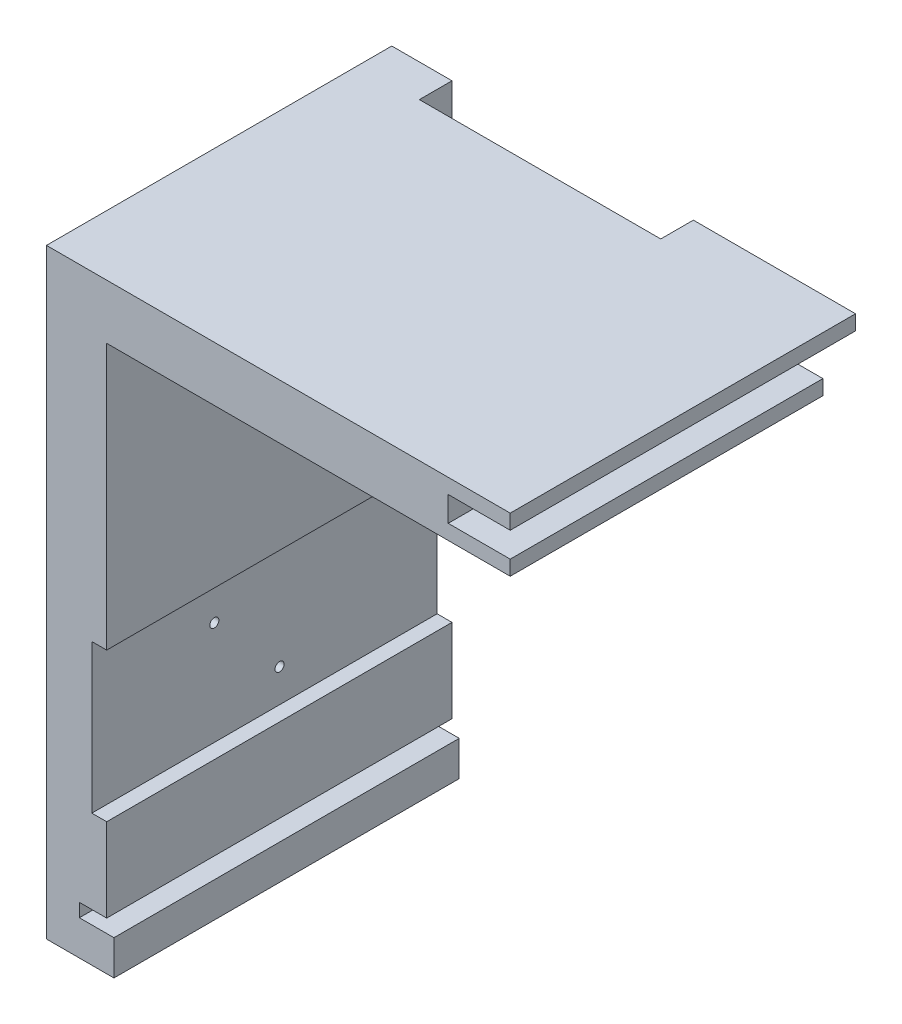
ISO-10303-21;
HEADER;
FILE_DESCRIPTION(('STEP AP214'),'2;1');
FILE_NAME('part.step','',(''),(''),'','','');
FILE_SCHEMA(('AUTOMOTIVE_DESIGN { 1 0 10303 214 1 1 1 1 }'));
ENDSEC;
DATA;
#1=APPLICATION_CONTEXT('core data for automotive mechanical design processes');
#2=APPLICATION_PROTOCOL_DEFINITION('international standard','automotive_design',2000,#1);
#3=PRODUCT_CONTEXT('',#1,'mechanical');
#4=PRODUCT('Part','Part','',(#3));
#5=PRODUCT_RELATED_PRODUCT_CATEGORY('part','',(#4));
#6=PRODUCT_DEFINITION_FORMATION('','',#4);
#7=PRODUCT_DEFINITION_CONTEXT('part definition',#1,'design');
#8=PRODUCT_DEFINITION('design','',#6,#7);
#9=PRODUCT_DEFINITION_SHAPE('','',#8);
#10=(LENGTH_UNIT() NAMED_UNIT(*) SI_UNIT(.MILLI.,.METRE.));
#11=(NAMED_UNIT(*) PLANE_ANGLE_UNIT() SI_UNIT($,.RADIAN.));
#12=(NAMED_UNIT(*) SI_UNIT($,.STERADIAN.) SOLID_ANGLE_UNIT());
#13=UNCERTAINTY_MEASURE_WITH_UNIT(LENGTH_MEASURE(1.E-05),#10,'distance_accuracy_value','');
#14=(GEOMETRIC_REPRESENTATION_CONTEXT(3) GLOBAL_UNCERTAINTY_ASSIGNED_CONTEXT((#13)) GLOBAL_UNIT_ASSIGNED_CONTEXT((#10,
#11,#12)) REPRESENTATION_CONTEXT('',''));
#15=CARTESIAN_POINT('',(0.,0.,0.));
#16=DIRECTION('',(0.,0.,1.));
#17=DIRECTION('',(1.,0.,0.));
#18=AXIS2_PLACEMENT_3D('',#15,#16,#17);
#19=CARTESIAN_POINT('',(0.,0.,95.25));
#20=DIRECTION('',(0.,-1.,0.));
#21=DIRECTION('',(0.,0.,-1.));
#22=AXIS2_PLACEMENT_3D('',#19,#20,#21);
#23=PLANE('',#22);
#24=DIRECTION('',(0.,0.,-1.));
#25=VECTOR('',#24,1.);
#26=CARTESIAN_POINT('',(-111.31,0.,95.25));
#27=LINE('',#26,#25);
#28=CARTESIAN_POINT('',(-111.31,0.,95.25));
#29=VERTEX_POINT('',#28);
#30=CARTESIAN_POINT('',(-111.31,0.,9.));
#31=VERTEX_POINT('',#30);
#32=EDGE_CURVE('E230',#29,#31,#27,.T.);
#33=ORIENTED_EDGE('',*,*,#32,.T.);
#34=DIRECTION('',(-1.,0.,0.));
#35=VECTOR('',#34,1.);
#36=CARTESIAN_POINT('',(-111.31,0.,9.));
#37=LINE('',#36,#35);
#38=CARTESIAN_POINT('',(0.,0.,9.));
#39=VERTEX_POINT('',#38);
#40=EDGE_CURVE('E352',#39,#31,#37,.T.);
#41=ORIENTED_EDGE('',*,*,#40,.F.);
#42=DIRECTION('',(0.,0.,-1.));
#43=VECTOR('',#42,1.);
#44=CARTESIAN_POINT('',(0.,0.,95.25));
#45=LINE('',#44,#43);
#46=CARTESIAN_POINT('',(0.,0.,95.25));
#47=VERTEX_POINT('',#46);
#48=EDGE_CURVE('E227',#47,#39,#45,.T.);
#49=ORIENTED_EDGE('',*,*,#48,.F.);
#50=DIRECTION('',(-1.,0.,0.));
#51=VECTOR('',#50,1.);
#52=CARTESIAN_POINT('',(0.,0.,95.25));
#53=LINE('',#52,#51);
#54=EDGE_CURVE('E302',#47,#29,#53,.T.);
#55=ORIENTED_EDGE('',*,*,#54,.T.);
#56=EDGE_LOOP('',(#33,#41,#49,#55));
#57=FACE_BOUND('',#56,.T.);
#58=ADVANCED_FACE('F34',(#57),#23,.T.);
#59=CARTESIAN_POINT('',(0.,0.,95.25));
#60=DIRECTION('',(-1.,0.,0.));
#61=DIRECTION('',(0.,0.,1.));
#62=AXIS2_PLACEMENT_3D('',#59,#60,#61);
#63=PLANE('',#62);
#64=DIRECTION('',(0.,-1.,0.));
#65=VECTOR('',#64,1.);
#66=CARTESIAN_POINT('',(0.,0.,9.));
#67=LINE('',#66,#65);
#68=CARTESIAN_POINT('',(0.,4.1,9.));
#69=VERTEX_POINT('',#68);
#70=EDGE_CURVE('E315',#69,#39,#67,.T.);
#71=ORIENTED_EDGE('',*,*,#70,.F.);
#72=DIRECTION('',(0.,0.,-1.));
#73=VECTOR('',#72,1.);
#74=CARTESIAN_POINT('',(0.,4.1,95.25));
#75=LINE('',#74,#73);
#76=CARTESIAN_POINT('',(0.,4.1,95.25));
#77=VERTEX_POINT('',#76);
#78=EDGE_CURVE('E224',#77,#69,#75,.T.);
#79=ORIENTED_EDGE('',*,*,#78,.F.);
#80=DIRECTION('',(0.,1.,0.));
#81=VECTOR('',#80,1.);
#82=CARTESIAN_POINT('',(0.,0.,95.25));
#83=LINE('',#82,#81);
#84=EDGE_CURVE('E305',#47,#77,#83,.T.);
#85=ORIENTED_EDGE('',*,*,#84,.F.);
#86=ORIENTED_EDGE('',*,*,#48,.T.);
#87=EDGE_LOOP('',(#71,#79,#85,#86));
#88=FACE_BOUND('',#87,.T.);
#89=ADVANCED_FACE('F312',(#88),#63,.F.);
#90=CARTESIAN_POINT('',(0.,4.1,95.25));
#91=DIRECTION('',(0.,-1.,0.));
#92=DIRECTION('',(1.,0.,0.));
#93=AXIS2_PLACEMENT_3D('',#90,#91,#92);
#94=PLANE('',#93);
#95=DIRECTION('',(1.,0.,0.));
#96=VECTOR('',#95,1.);
#97=CARTESIAN_POINT('',(0.,4.1,8.99999999999999));
#98=LINE('',#97,#96);
#99=CARTESIAN_POINT('',(-17.1,4.1,8.99999999999999));
#100=VERTEX_POINT('',#99);
#101=EDGE_CURVE('E320',#100,#69,#98,.T.);
#102=ORIENTED_EDGE('',*,*,#101,.F.);
#103=DIRECTION('',(0.,0.,-1.));
#104=VECTOR('',#103,1.);
#105=CARTESIAN_POINT('',(-17.1,4.1,95.25));
#106=LINE('',#105,#104);
#107=CARTESIAN_POINT('',(-17.1,4.1,95.25));
#108=VERTEX_POINT('',#107);
#109=EDGE_CURVE('E179',#108,#100,#106,.T.);
#110=ORIENTED_EDGE('',*,*,#109,.F.);
#111=DIRECTION('',(-1.,0.,0.));
#112=VECTOR('',#111,1.);
#113=CARTESIAN_POINT('',(0.,4.1,95.25));
#114=LINE('',#113,#112);
#115=EDGE_CURVE('E165',#77,#108,#114,.T.);
#116=ORIENTED_EDGE('',*,*,#115,.F.);
#117=ORIENTED_EDGE('',*,*,#78,.T.);
#118=EDGE_LOOP('',(#102,#110,#116,#117));
#119=FACE_BOUND('',#118,.T.);
#120=ADVANCED_FACE('F318',(#119),#94,.F.);
#121=CARTESIAN_POINT('',(-17.1,4.1,95.25));
#122=DIRECTION('',(-1.,0.,0.));
#123=DIRECTION('',(0.,0.,1.));
#124=AXIS2_PLACEMENT_3D('',#121,#122,#123);
#125=PLANE('',#124);
#126=DIRECTION('',(0.,-1.,0.));
#127=VECTOR('',#126,1.);
#128=CARTESIAN_POINT('',(-17.1,4.1,8.99999999999999));
#129=LINE('',#128,#127);
#130=CARTESIAN_POINT('',(-17.1,10.99,9.));
#131=VERTEX_POINT('',#130);
#132=EDGE_CURVE('E176',#131,#100,#129,.T.);
#133=ORIENTED_EDGE('',*,*,#132,.F.);
#134=DIRECTION('',(0.,0.,-1.));
#135=VECTOR('',#134,1.);
#136=CARTESIAN_POINT('',(-17.1,10.99,95.25));
#137=LINE('',#136,#135);
#138=CARTESIAN_POINT('',(-17.1,10.99,95.25));
#139=VERTEX_POINT('',#138);
#140=EDGE_CURVE('E172',#139,#131,#137,.T.);
#141=ORIENTED_EDGE('',*,*,#140,.F.);
#142=DIRECTION('',(0.,1.,0.));
#143=VECTOR('',#142,1.);
#144=CARTESIAN_POINT('',(-17.1,4.1,95.25));
#145=LINE('',#144,#143);
#146=EDGE_CURVE('E158',#108,#139,#145,.T.);
#147=ORIENTED_EDGE('',*,*,#146,.F.);
#148=ORIENTED_EDGE('',*,*,#109,.T.);
#149=EDGE_LOOP('',(#133,#141,#147,#148));
#150=FACE_BOUND('',#149,.T.);
#151=ADVANCED_FACE('F173',(#150),#125,.F.);
#152=CARTESIAN_POINT('',(0.,0.,0.));
#153=DIRECTION('',(0.,0.,1.));
#154=DIRECTION('',(1.,0.,0.));
#155=AXIS2_PLACEMENT_3D('',#152,#153,#154);
#156=PLANE('',#155);
#157=DIRECTION('',(-1.,0.,0.));
#158=VECTOR('',#157,1.);
#159=CARTESIAN_POINT('',(0.,15.09,0.));
#160=LINE('',#159,#158);
#161=CARTESIAN_POINT('',(-111.31,15.09,0.));
#162=VERTEX_POINT('',#161);
#163=CARTESIAN_POINT('',(-127.92,15.09,0.));
#164=VERTEX_POINT('',#163);
#165=EDGE_CURVE('E193',#162,#164,#160,.T.);
#166=ORIENTED_EDGE('',*,*,#165,.F.);
#167=DIRECTION('',(0.,-1.,0.));
#168=VECTOR('',#167,1.);
#169=CARTESIAN_POINT('',(-111.31,0.,0.));
#170=LINE('',#169,#168);
#171=CARTESIAN_POINT('',(-111.31,-73.29,0.));
#172=VERTEX_POINT('',#171);
#173=EDGE_CURVE('E214',#162,#172,#170,.T.);
#174=ORIENTED_EDGE('',*,*,#173,.T.);
#175=DIRECTION('',(1.,0.,0.));
#176=VECTOR('',#175,1.);
#177=CARTESIAN_POINT('',(-115.41,-73.29,0.));
#178=LINE('',#177,#176);
#179=CARTESIAN_POINT('',(-115.41,-73.29,0.));
#180=VERTEX_POINT('',#179);
#181=EDGE_CURVE('E211',#180,#172,#178,.T.);
#182=ORIENTED_EDGE('',*,*,#181,.F.);
#183=DIRECTION('',(0.,1.,0.));
#184=VECTOR('',#183,1.);
#185=CARTESIAN_POINT('',(-115.41,-114.29,0.));
#186=LINE('',#185,#184);
#187=CARTESIAN_POINT('',(-115.41,-114.29,0.));
#188=VERTEX_POINT('',#187);
#189=EDGE_CURVE('E209',#188,#180,#186,.T.);
#190=ORIENTED_EDGE('',*,*,#189,.F.);
#191=DIRECTION('',(-1.,0.,0.));
#192=VECTOR('',#191,1.);
#193=CARTESIAN_POINT('',(-111.31,-114.29,0.));
#194=LINE('',#193,#192);
#195=CARTESIAN_POINT('',(-111.31,-114.29,0.));
#196=VERTEX_POINT('',#195);
#197=EDGE_CURVE('E207',#196,#188,#194,.T.);
#198=ORIENTED_EDGE('',*,*,#197,.F.);
#199=DIRECTION('',(0.,1.,0.));
#200=VECTOR('',#199,1.);
#201=CARTESIAN_POINT('',(-111.31,-137.31,0.));
#202=LINE('',#201,#200);
#203=CARTESIAN_POINT('',(-111.31,-137.31,0.));
#204=VERTEX_POINT('',#203);
#205=EDGE_CURVE('E205',#204,#196,#202,.T.);
#206=ORIENTED_EDGE('',*,*,#205,.F.);
#207=DIRECTION('',(1.,0.,0.));
#208=VECTOR('',#207,1.);
#209=CARTESIAN_POINT('',(-118.84,-137.31,0.));
#210=LINE('',#209,#208);
#211=CARTESIAN_POINT('',(-118.84,-137.31,0.));
#212=VERTEX_POINT('',#211);
#213=EDGE_CURVE('E203',#212,#204,#210,.T.);
#214=ORIENTED_EDGE('',*,*,#213,.F.);
#215=DIRECTION('',(0.,1.,0.));
#216=VECTOR('',#215,1.);
#217=CARTESIAN_POINT('',(-118.84,-140.99,0.));
#218=LINE('',#217,#216);
#219=CARTESIAN_POINT('',(-118.84,-140.99,0.));
#220=VERTEX_POINT('',#219);
#221=EDGE_CURVE('E201',#220,#212,#218,.T.);
#222=ORIENTED_EDGE('',*,*,#221,.F.);
#223=DIRECTION('',(-1.,0.,0.));
#224=VECTOR('',#223,1.);
#225=CARTESIAN_POINT('',(-109.31,-140.99,0.));
#226=LINE('',#225,#224);
#227=CARTESIAN_POINT('',(-109.31,-140.99,0.));
#228=VERTEX_POINT('',#227);
#229=EDGE_CURVE('E199',#228,#220,#226,.T.);
#230=ORIENTED_EDGE('',*,*,#229,.F.);
#231=DIRECTION('',(0.,1.,0.));
#232=VECTOR('',#231,1.);
#233=CARTESIAN_POINT('',(-109.31,-150.62,0.));
#234=LINE('',#233,#232);
#235=CARTESIAN_POINT('',(-109.31,-150.62,0.));
#236=VERTEX_POINT('',#235);
#237=EDGE_CURVE('E197',#236,#228,#234,.T.);
#238=ORIENTED_EDGE('',*,*,#237,.F.);
#239=DIRECTION('',(1.,0.,0.));
#240=VECTOR('',#239,1.);
#241=CARTESIAN_POINT('',(-127.92,-150.62,0.));
#242=LINE('',#241,#240);
#243=CARTESIAN_POINT('',(-127.92,-150.62,0.));
#244=VERTEX_POINT('',#243);
#245=EDGE_CURVE('E195',#244,#236,#242,.T.);
#246=ORIENTED_EDGE('',*,*,#245,.F.);
#247=DIRECTION('',(0.,-1.,0.));
#248=VECTOR('',#247,1.);
#249=CARTESIAN_POINT('',(-127.92,15.09,0.));
#250=LINE('',#249,#248);
#251=EDGE_CURVE('E192',#164,#244,#250,.T.);
#252=ORIENTED_EDGE('',*,*,#251,.F.);
#253=EDGE_LOOP('',(#166,#174,#182,#190,#198,#206,#214,#222,#230,#238,#246,#252));
#254=FACE_BOUND('',#253,.T.);
#255=ADVANCED_FACE('F269',(#254),#156,.F.);
#256=CARTESIAN_POINT('',(0.,15.09,95.25));
#257=DIRECTION('',(0.,-1.,0.));
#258=DIRECTION('',(1.,0.,0.));
#259=AXIS2_PLACEMENT_3D('',#256,#257,#258);
#260=PLANE('',#259);
#261=DIRECTION('',(1.,0.,0.));
#262=VECTOR('',#261,1.);
#263=CARTESIAN_POINT('',(-111.31,15.09,9.));
#264=LINE('',#263,#262);
#265=CARTESIAN_POINT('',(-111.31,15.09,9.));
#266=VERTEX_POINT('',#265);
#267=CARTESIAN_POINT('',(-44.73,15.09,9.));
#268=VERTEX_POINT('',#267);
#269=EDGE_CURVE('E357',#266,#268,#264,.T.);
#270=ORIENTED_EDGE('',*,*,#269,.F.);
#271=DIRECTION('',(0.,0.,-1.));
#272=VECTOR('',#271,1.);
#273=CARTESIAN_POINT('',(-111.31,15.09,9.));
#274=LINE('',#273,#272);
#275=EDGE_CURVE('E345',#266,#162,#274,.T.);
#276=ORIENTED_EDGE('',*,*,#275,.T.);
#277=ORIENTED_EDGE('',*,*,#165,.T.);
#278=DIRECTION('',(0.,0.,-1.));
#279=VECTOR('',#278,1.);
#280=CARTESIAN_POINT('',(-127.92,15.09,95.25));
#281=LINE('',#280,#279);
#282=CARTESIAN_POINT('',(-127.92,15.09,95.25));
#283=VERTEX_POINT('',#282);
#284=EDGE_CURVE('E11',#283,#164,#281,.T.);
#285=ORIENTED_EDGE('',*,*,#284,.F.);
#286=DIRECTION('',(-1.,0.,0.));
#287=VECTOR('',#286,1.);
#288=CARTESIAN_POINT('',(0.,15.09,95.25));
#289=LINE('',#288,#287);
#290=CARTESIAN_POINT('',(0.,15.09,95.25));
#291=VERTEX_POINT('',#290);
#292=EDGE_CURVE('E220',#291,#283,#289,.T.);
#293=ORIENTED_EDGE('',*,*,#292,.F.);
#294=DIRECTION('',(0.,0.,-1.));
#295=VECTOR('',#294,1.);
#296=CARTESIAN_POINT('',(0.,15.09,95.25));
#297=LINE('',#296,#295);
#298=CARTESIAN_POINT('',(0.,15.09,0.));
#299=VERTEX_POINT('',#298);
#300=EDGE_CURVE('E185',#291,#299,#297,.T.);
#301=ORIENTED_EDGE('',*,*,#300,.T.);
#302=CARTESIAN_POINT('',(-44.73,15.09,0.));
#303=VERTEX_POINT('',#302);
#304=EDGE_CURVE('E189',#299,#303,#160,.T.);
#305=ORIENTED_EDGE('',*,*,#304,.T.);
#306=DIRECTION('',(0.,0.,-1.));
#307=VECTOR('',#306,1.);
#308=CARTESIAN_POINT('',(-44.73,15.09,9.));
#309=LINE('',#308,#307);
#310=EDGE_CURVE('E49',#268,#303,#309,.T.);
#311=ORIENTED_EDGE('',*,*,#310,.F.);
#312=EDGE_LOOP('',(#270,#276,#277,#285,#293,#301,#305,#311));
#313=FACE_BOUND('',#312,.T.);
#314=ADVANCED_FACE('F36',(#313),#260,.F.);
#315=CARTESIAN_POINT('',(-127.92,15.09,95.25));
#316=DIRECTION('',(1.,0.,0.));
#317=DIRECTION('',(0.,0.,-1.));
#318=AXIS2_PLACEMENT_3D('',#315,#316,#317);
#319=PLANE('',#318);
#320=ORIENTED_EDGE('',*,*,#251,.T.);
#321=DIRECTION('',(0.,0.,-1.));
#322=VECTOR('',#321,1.);
#323=CARTESIAN_POINT('',(-127.92,-150.62,95.25));
#324=LINE('',#323,#322);
#325=CARTESIAN_POINT('',(-127.92,-150.62,95.25));
#326=VERTEX_POINT('',#325);
#327=EDGE_CURVE('E42',#326,#244,#324,.T.);
#328=ORIENTED_EDGE('',*,*,#327,.F.);
#329=DIRECTION('',(0.,-1.,0.));
#330=VECTOR('',#329,1.);
#331=CARTESIAN_POINT('',(-127.92,15.09,95.25));
#332=LINE('',#331,#330);
#333=EDGE_CURVE('E113',#283,#326,#332,.T.);
#334=ORIENTED_EDGE('',*,*,#333,.F.);
#335=ORIENTED_EDGE('',*,*,#284,.T.);
#336=EDGE_LOOP('',(#320,#328,#334,#335));
#337=FACE_BOUND('',#336,.T.);
#338=ADVANCED_FACE('F381',(#337),#319,.F.);
#339=CARTESIAN_POINT('',(-127.92,-150.62,95.25));
#340=DIRECTION('',(0.,1.,0.));
#341=DIRECTION('',(0.,0.,1.));
#342=AXIS2_PLACEMENT_3D('',#339,#340,#341);
#343=PLANE('',#342);
#344=ORIENTED_EDGE('',*,*,#245,.T.);
#345=DIRECTION('',(0.,0.,-1.));
#346=VECTOR('',#345,1.);
#347=CARTESIAN_POINT('',(-109.31,-150.62,95.25));
#348=LINE('',#347,#346);
#349=CARTESIAN_POINT('',(-109.31,-150.62,95.25));
#350=VERTEX_POINT('',#349);
#351=EDGE_CURVE('E256',#350,#236,#348,.T.);
#352=ORIENTED_EDGE('',*,*,#351,.F.);
#353=DIRECTION('',(1.,0.,0.));
#354=VECTOR('',#353,1.);
#355=CARTESIAN_POINT('',(-127.92,-150.62,95.25));
#356=LINE('',#355,#354);
#357=EDGE_CURVE('E264',#326,#350,#356,.T.);
#358=ORIENTED_EDGE('',*,*,#357,.F.);
#359=ORIENTED_EDGE('',*,*,#327,.T.);
#360=EDGE_LOOP('',(#344,#352,#358,#359));
#361=FACE_BOUND('',#360,.T.);
#362=ADVANCED_FACE('F262',(#361),#343,.F.);
#363=CARTESIAN_POINT('',(-109.31,-150.62,95.25));
#364=DIRECTION('',(-1.,0.,0.));
#365=DIRECTION('',(0.,0.,1.));
#366=AXIS2_PLACEMENT_3D('',#363,#364,#365);
#367=PLANE('',#366);
#368=ORIENTED_EDGE('',*,*,#237,.T.);
#369=DIRECTION('',(0.,0.,-1.));
#370=VECTOR('',#369,1.);
#371=CARTESIAN_POINT('',(-109.31,-140.99,95.25));
#372=LINE('',#371,#370);
#373=CARTESIAN_POINT('',(-109.31,-140.99,95.25));
#374=VERTEX_POINT('',#373);
#375=EDGE_CURVE('E253',#374,#228,#372,.T.);
#376=ORIENTED_EDGE('',*,*,#375,.F.);
#377=DIRECTION('',(0.,1.,0.));
#378=VECTOR('',#377,1.);
#379=CARTESIAN_POINT('',(-109.31,-150.62,95.25));
#380=LINE('',#379,#378);
#381=EDGE_CURVE('E283',#350,#374,#380,.T.);
#382=ORIENTED_EDGE('',*,*,#381,.F.);
#383=ORIENTED_EDGE('',*,*,#351,.T.);
#384=EDGE_LOOP('',(#368,#376,#382,#383));
#385=FACE_BOUND('',#384,.T.);
#386=ADVANCED_FACE('F274',(#385),#367,.F.);
#387=CARTESIAN_POINT('',(-109.31,-140.99,95.25));
#388=DIRECTION('',(0.,-1.,0.));
#389=DIRECTION('',(0.,0.,-1.));
#390=AXIS2_PLACEMENT_3D('',#387,#388,#389);
#391=PLANE('',#390);
#392=ORIENTED_EDGE('',*,*,#229,.T.);
#393=DIRECTION('',(0.,0.,-1.));
#394=VECTOR('',#393,1.);
#395=CARTESIAN_POINT('',(-118.84,-140.99,95.25));
#396=LINE('',#395,#394);
#397=CARTESIAN_POINT('',(-118.84,-140.99,95.25));
#398=VERTEX_POINT('',#397);
#399=EDGE_CURVE('E250',#398,#220,#396,.T.);
#400=ORIENTED_EDGE('',*,*,#399,.F.);
#401=DIRECTION('',(-1.,0.,0.));
#402=VECTOR('',#401,1.);
#403=CARTESIAN_POINT('',(-109.31,-140.99,95.25));
#404=LINE('',#403,#402);
#405=EDGE_CURVE('E280',#374,#398,#404,.T.);
#406=ORIENTED_EDGE('',*,*,#405,.F.);
#407=ORIENTED_EDGE('',*,*,#375,.T.);
#408=EDGE_LOOP('',(#392,#400,#406,#407));
#409=FACE_BOUND('',#408,.T.);
#410=ADVANCED_FACE('F278',(#409),#391,.F.);
#411=CARTESIAN_POINT('',(-118.84,-140.99,95.25));
#412=DIRECTION('',(-1.,0.,0.));
#413=DIRECTION('',(0.,0.,1.));
#414=AXIS2_PLACEMENT_3D('',#411,#412,#413);
#415=PLANE('',#414);
#416=ORIENTED_EDGE('',*,*,#221,.T.);
#417=DIRECTION('',(0.,0.,-1.));
#418=VECTOR('',#417,1.);
#419=CARTESIAN_POINT('',(-118.84,-137.31,95.25));
#420=LINE('',#419,#418);
#421=CARTESIAN_POINT('',(-118.84,-137.31,95.25));
#422=VERTEX_POINT('',#421);
#423=EDGE_CURVE('E247',#422,#212,#420,.T.);
#424=ORIENTED_EDGE('',*,*,#423,.F.);
#425=DIRECTION('',(0.,1.,0.));
#426=VECTOR('',#425,1.);
#427=CARTESIAN_POINT('',(-118.84,-140.99,95.25));
#428=LINE('',#427,#426);
#429=EDGE_CURVE('E282',#398,#422,#428,.T.);
#430=ORIENTED_EDGE('',*,*,#429,.F.);
#431=ORIENTED_EDGE('',*,*,#399,.T.);
#432=EDGE_LOOP('',(#416,#424,#430,#431));
#433=FACE_BOUND('',#432,.T.);
#434=ADVANCED_FACE('F418',(#433),#415,.F.);
#435=CARTESIAN_POINT('',(-118.84,-137.31,95.25));
#436=DIRECTION('',(0.,1.,0.));
#437=DIRECTION('',(0.,0.,1.));
#438=AXIS2_PLACEMENT_3D('',#435,#436,#437);
#439=PLANE('',#438);
#440=ORIENTED_EDGE('',*,*,#213,.T.);
#441=DIRECTION('',(0.,0.,-1.));
#442=VECTOR('',#441,1.);
#443=CARTESIAN_POINT('',(-111.31,-137.31,95.25));
#444=LINE('',#443,#442);
#445=CARTESIAN_POINT('',(-111.31,-137.31,95.25));
#446=VERTEX_POINT('',#445);
#447=EDGE_CURVE('E244',#446,#204,#444,.T.);
#448=ORIENTED_EDGE('',*,*,#447,.F.);
#449=DIRECTION('',(1.,0.,0.));
#450=VECTOR('',#449,1.);
#451=CARTESIAN_POINT('',(-118.84,-137.31,95.25));
#452=LINE('',#451,#450);
#453=EDGE_CURVE('E285',#422,#446,#452,.T.);
#454=ORIENTED_EDGE('',*,*,#453,.F.);
#455=ORIENTED_EDGE('',*,*,#423,.T.);
#456=EDGE_LOOP('',(#440,#448,#454,#455));
#457=FACE_BOUND('',#456,.T.);
#458=ADVANCED_FACE('F414',(#457),#439,.F.);
#459=CARTESIAN_POINT('',(-111.31,-137.31,95.25));
#460=DIRECTION('',(-1.,0.,0.));
#461=DIRECTION('',(0.,0.,1.));
#462=AXIS2_PLACEMENT_3D('',#459,#460,#461);
#463=PLANE('',#462);
#464=ORIENTED_EDGE('',*,*,#205,.T.);
#465=DIRECTION('',(0.,0.,-1.));
#466=VECTOR('',#465,1.);
#467=CARTESIAN_POINT('',(-111.31,-114.29,95.25));
#468=LINE('',#467,#466);
#469=CARTESIAN_POINT('',(-111.31,-114.29,95.25));
#470=VERTEX_POINT('',#469);
#471=EDGE_CURVE('E241',#470,#196,#468,.T.);
#472=ORIENTED_EDGE('',*,*,#471,.F.);
#473=DIRECTION('',(0.,1.,0.));
#474=VECTOR('',#473,1.);
#475=CARTESIAN_POINT('',(-111.31,-137.31,95.25));
#476=LINE('',#475,#474);
#477=EDGE_CURVE('E291',#446,#470,#476,.T.);
#478=ORIENTED_EDGE('',*,*,#477,.F.);
#479=ORIENTED_EDGE('',*,*,#447,.T.);
#480=EDGE_LOOP('',(#464,#472,#478,#479));
#481=FACE_BOUND('',#480,.T.);
#482=ADVANCED_FACE('F410',(#481),#463,.F.);
#483=CARTESIAN_POINT('',(-111.31,-114.29,95.25));
#484=DIRECTION('',(0.,-1.,0.));
#485=DIRECTION('',(0.,0.,-1.));
#486=AXIS2_PLACEMENT_3D('',#483,#484,#485);
#487=PLANE('',#486);
#488=ORIENTED_EDGE('',*,*,#197,.T.);
#489=DIRECTION('',(0.,0.,-1.));
#490=VECTOR('',#489,1.);
#491=CARTESIAN_POINT('',(-115.41,-114.29,95.25));
#492=LINE('',#491,#490);
#493=CARTESIAN_POINT('',(-115.41,-114.29,95.25));
#494=VERTEX_POINT('',#493);
#495=EDGE_CURVE('E238',#494,#188,#492,.T.);
#496=ORIENTED_EDGE('',*,*,#495,.F.);
#497=DIRECTION('',(-1.,0.,0.));
#498=VECTOR('',#497,1.);
#499=CARTESIAN_POINT('',(-111.31,-114.29,95.25));
#500=LINE('',#499,#498);
#501=EDGE_CURVE('E293',#470,#494,#500,.T.);
#502=ORIENTED_EDGE('',*,*,#501,.F.);
#503=ORIENTED_EDGE('',*,*,#471,.T.);
#504=EDGE_LOOP('',(#488,#496,#502,#503));
#505=FACE_BOUND('',#504,.T.);
#506=ADVANCED_FACE('F406',(#505),#487,.F.);
#507=CARTESIAN_POINT('',(-115.41,-114.29,95.25));
#508=DIRECTION('',(-1.,0.,0.));
#509=DIRECTION('',(0.,0.,1.));
#510=AXIS2_PLACEMENT_3D('',#507,#508,#509);
#511=PLANE('',#510);
#512=CARTESIAN_POINT('',(-115.41,-105.21,43.46));
#513=DIRECTION('',(1.,0.,0.));
#514=DIRECTION('',(0.,0.,-1.));
#515=AXIS2_PLACEMENT_3D('',#512,#513,#514);
#516=CIRCLE('',#515,1.25);
#517=CARTESIAN_POINT('',(-115.41,-105.21,42.21));
#518=VERTEX_POINT('',#517);
#519=EDGE_CURVE('E628',#518,#518,#516,.T.);
#520=ORIENTED_EDGE('',*,*,#519,.F.);
#521=EDGE_LOOP('',(#520));
#522=FACE_BOUND('',#521,.T.);
#523=CARTESIAN_POINT('',(-115.41,-85.71,61.46));
#524=DIRECTION('',(1.,0.,0.));
#525=DIRECTION('',(0.,0.,-1.));
#526=AXIS2_PLACEMENT_3D('',#523,#524,#525);
#527=CIRCLE('',#526,1.25);
#528=CARTESIAN_POINT('',(-115.41,-85.71,60.21));
#529=VERTEX_POINT('',#528);
#530=EDGE_CURVE('E635',#529,#529,#527,.T.);
#531=ORIENTED_EDGE('',*,*,#530,.F.);
#532=EDGE_LOOP('',(#531));
#533=FACE_BOUND('',#532,.T.);
#534=ORIENTED_EDGE('',*,*,#189,.T.);
#535=DIRECTION('',(0.,0.,-1.));
#536=VECTOR('',#535,1.);
#537=CARTESIAN_POINT('',(-115.41,-73.29,95.25));
#538=LINE('',#537,#536);
#539=CARTESIAN_POINT('',(-115.41,-73.29,95.25));
#540=VERTEX_POINT('',#539);
#541=EDGE_CURVE('E235',#540,#180,#538,.T.);
#542=ORIENTED_EDGE('',*,*,#541,.F.);
#543=DIRECTION('',(0.,1.,0.));
#544=VECTOR('',#543,1.);
#545=CARTESIAN_POINT('',(-115.41,-114.29,95.25));
#546=LINE('',#545,#544);
#547=EDGE_CURVE('E295',#494,#540,#546,.T.);
#548=ORIENTED_EDGE('',*,*,#547,.F.);
#549=ORIENTED_EDGE('',*,*,#495,.T.);
#550=EDGE_LOOP('',(#534,#542,#548,#549));
#551=FACE_BOUND('',#550,.T.);
#552=ADVANCED_FACE('F402',(#522,#533,#551),#511,.F.);
#553=CARTESIAN_POINT('',(-115.41,-73.29,95.25));
#554=DIRECTION('',(0.,1.,0.));
#555=DIRECTION('',(0.,0.,1.));
#556=AXIS2_PLACEMENT_3D('',#553,#554,#555);
#557=PLANE('',#556);
#558=ORIENTED_EDGE('',*,*,#181,.T.);
#559=DIRECTION('',(0.,0.,-1.));
#560=VECTOR('',#559,1.);
#561=CARTESIAN_POINT('',(-111.31,-73.29,95.25));
#562=LINE('',#561,#560);
#563=CARTESIAN_POINT('',(-111.31,-73.29,95.25));
#564=VERTEX_POINT('',#563);
#565=EDGE_CURVE('E233',#564,#172,#562,.T.);
#566=ORIENTED_EDGE('',*,*,#565,.F.);
#567=DIRECTION('',(1.,0.,0.));
#568=VECTOR('',#567,1.);
#569=CARTESIAN_POINT('',(-115.41,-73.29,95.25));
#570=LINE('',#569,#568);
#571=EDGE_CURVE('E297',#540,#564,#570,.T.);
#572=ORIENTED_EDGE('',*,*,#571,.F.);
#573=ORIENTED_EDGE('',*,*,#541,.T.);
#574=EDGE_LOOP('',(#558,#566,#572,#573));
#575=FACE_BOUND('',#574,.T.);
#576=ADVANCED_FACE('F399',(#575),#557,.F.);
#577=CARTESIAN_POINT('',(-111.31,0.,95.25));
#578=DIRECTION('',(1.,0.,0.));
#579=DIRECTION('',(0.,1.,0.));
#580=AXIS2_PLACEMENT_3D('',#577,#578,#579);
#581=PLANE('',#580);
#582=ORIENTED_EDGE('',*,*,#173,.F.);
#583=ORIENTED_EDGE('',*,*,#275,.F.);
#584=DIRECTION('',(0.,1.,0.));
#585=VECTOR('',#584,1.);
#586=CARTESIAN_POINT('',(-111.31,0.,9.));
#587=LINE('',#586,#585);
#588=EDGE_CURVE('E348',#31,#266,#587,.T.);
#589=ORIENTED_EDGE('',*,*,#588,.F.);
#590=ORIENTED_EDGE('',*,*,#32,.F.);
#591=DIRECTION('',(0.,-1.,0.));
#592=VECTOR('',#591,1.);
#593=CARTESIAN_POINT('',(-111.31,0.,95.25));
#594=LINE('',#593,#592);
#595=EDGE_CURVE('E299',#29,#564,#594,.T.);
#596=ORIENTED_EDGE('',*,*,#595,.T.);
#597=ORIENTED_EDGE('',*,*,#565,.T.);
#598=EDGE_LOOP('',(#582,#583,#589,#590,#596,#597));
#599=FACE_BOUND('',#598,.T.);
#600=ADVANCED_FACE('F347',(#599),#581,.T.);
#601=CARTESIAN_POINT('',(-17.1,10.99,95.25));
#602=DIRECTION('',(0.,1.,0.));
#603=DIRECTION('',(-1.,0.,0.));
#604=AXIS2_PLACEMENT_3D('',#601,#602,#603);
#605=PLANE('',#604);
#606=DIRECTION('',(1.,0.,0.));
#607=VECTOR('',#606,1.);
#608=CARTESIAN_POINT('',(-17.1,10.99,0.));
#609=LINE('',#608,#607);
#610=CARTESIAN_POINT('',(-44.73,10.99,0.));
#611=VERTEX_POINT('',#610);
#612=CARTESIAN_POINT('',(0.,10.99,0.));
#613=VERTEX_POINT('',#612);
#614=EDGE_CURVE('E217',#611,#613,#609,.T.);
#615=ORIENTED_EDGE('',*,*,#614,.T.);
#616=DIRECTION('',(0.,0.,-1.));
#617=VECTOR('',#616,1.);
#618=CARTESIAN_POINT('',(0.,10.99,95.25));
#619=LINE('',#618,#617);
#620=CARTESIAN_POINT('',(0.,10.99,95.25));
#621=VERTEX_POINT('',#620);
#622=EDGE_CURVE('E180',#621,#613,#619,.T.);
#623=ORIENTED_EDGE('',*,*,#622,.F.);
#624=DIRECTION('',(1.,0.,0.));
#625=VECTOR('',#624,1.);
#626=CARTESIAN_POINT('',(-17.1,10.99,95.25));
#627=LINE('',#626,#625);
#628=EDGE_CURVE('E162',#139,#621,#627,.T.);
#629=ORIENTED_EDGE('',*,*,#628,.F.);
#630=ORIENTED_EDGE('',*,*,#140,.T.);
#631=DIRECTION('',(1.,0.,0.));
#632=VECTOR('',#631,1.);
#633=CARTESIAN_POINT('',(0.,10.99,9.));
#634=LINE('',#633,#632);
#635=CARTESIAN_POINT('',(-44.73,10.99,9.));
#636=VERTEX_POINT('',#635);
#637=EDGE_CURVE('E363',#636,#131,#634,.T.);
#638=ORIENTED_EDGE('',*,*,#637,.F.);
#639=DIRECTION('',(0.,0.,-1.));
#640=VECTOR('',#639,1.);
#641=CARTESIAN_POINT('',(-44.73,10.99,9.));
#642=LINE('',#641,#640);
#643=EDGE_CURVE('E372',#636,#611,#642,.T.);
#644=ORIENTED_EDGE('',*,*,#643,.T.);
#645=EDGE_LOOP('',(#615,#623,#629,#630,#638,#644));
#646=FACE_BOUND('',#645,.T.);
#647=ADVANCED_FACE('F183',(#646),#605,.F.);
#648=CARTESIAN_POINT('',(0.,10.99,95.25));
#649=DIRECTION('',(-1.,0.,0.));
#650=DIRECTION('',(0.,0.,1.));
#651=AXIS2_PLACEMENT_3D('',#648,#649,#650);
#652=PLANE('',#651);
#653=DIRECTION('',(0.,1.,0.));
#654=VECTOR('',#653,1.);
#655=CARTESIAN_POINT('',(0.,10.99,0.));
#656=LINE('',#655,#654);
#657=EDGE_CURVE('E105',#613,#299,#656,.T.);
#658=ORIENTED_EDGE('',*,*,#657,.T.);
#659=ORIENTED_EDGE('',*,*,#300,.F.);
#660=DIRECTION('',(0.,1.,0.));
#661=VECTOR('',#660,1.);
#662=CARTESIAN_POINT('',(0.,10.99,95.25));
#663=LINE('',#662,#661);
#664=EDGE_CURVE('E58',#621,#291,#663,.T.);
#665=ORIENTED_EDGE('',*,*,#664,.F.);
#666=ORIENTED_EDGE('',*,*,#622,.T.);
#667=EDGE_LOOP('',(#658,#659,#665,#666));
#668=FACE_BOUND('',#667,.T.);
#669=ADVANCED_FACE('F472',(#668),#652,.F.);
#670=CARTESIAN_POINT('',(0.,0.,95.25));
#671=DIRECTION('',(0.,0.,1.));
#672=DIRECTION('',(1.,0.,0.));
#673=AXIS2_PLACEMENT_3D('',#670,#671,#672);
#674=PLANE('',#673);
#675=ORIENTED_EDGE('',*,*,#292,.T.);
#676=ORIENTED_EDGE('',*,*,#333,.T.);
#677=ORIENTED_EDGE('',*,*,#357,.T.);
#678=ORIENTED_EDGE('',*,*,#381,.T.);
#679=ORIENTED_EDGE('',*,*,#405,.T.);
#680=ORIENTED_EDGE('',*,*,#429,.T.);
#681=ORIENTED_EDGE('',*,*,#453,.T.);
#682=ORIENTED_EDGE('',*,*,#477,.T.);
#683=ORIENTED_EDGE('',*,*,#501,.T.);
#684=ORIENTED_EDGE('',*,*,#547,.T.);
#685=ORIENTED_EDGE('',*,*,#571,.T.);
#686=ORIENTED_EDGE('',*,*,#595,.F.);
#687=ORIENTED_EDGE('',*,*,#54,.F.);
#688=ORIENTED_EDGE('',*,*,#84,.T.);
#689=ORIENTED_EDGE('',*,*,#115,.T.);
#690=ORIENTED_EDGE('',*,*,#146,.T.);
#691=ORIENTED_EDGE('',*,*,#628,.T.);
#692=ORIENTED_EDGE('',*,*,#664,.T.);
#693=EDGE_LOOP('',(#675,#676,#677,#678,#679,#680,#681,#682,#683,#684,#685,#686,#687,#688,#689,
#690,#691,#692));
#694=FACE_BOUND('',#693,.T.);
#695=ADVANCED_FACE('F160',(#694),#674,.T.);
#696=ORIENTED_EDGE('',*,*,#614,.F.);
#697=DIRECTION('',(0.,-1.,0.));
#698=VECTOR('',#697,1.);
#699=CARTESIAN_POINT('',(-44.73,10.99,0.));
#700=LINE('',#699,#698);
#701=EDGE_CURVE('E359',#303,#611,#700,.T.);
#702=ORIENTED_EDGE('',*,*,#701,.F.);
#703=ORIENTED_EDGE('',*,*,#304,.F.);
#704=ORIENTED_EDGE('',*,*,#657,.F.);
#705=EDGE_LOOP('',(#696,#702,#703,#704));
#706=FACE_BOUND('',#705,.T.);
#707=ADVANCED_FACE('F485',(#706),#156,.F.);
#708=CARTESIAN_POINT('',(0.,0.,9.));
#709=DIRECTION('',(0.,0.,-1.));
#710=DIRECTION('',(-1.,0.,0.));
#711=AXIS2_PLACEMENT_3D('',#708,#709,#710);
#712=PLANE('',#711);
#713=ORIENTED_EDGE('',*,*,#101,.T.);
#714=ORIENTED_EDGE('',*,*,#70,.T.);
#715=ORIENTED_EDGE('',*,*,#40,.T.);
#716=ORIENTED_EDGE('',*,*,#588,.T.);
#717=ORIENTED_EDGE('',*,*,#269,.T.);
#718=DIRECTION('',(0.,-1.,0.));
#719=VECTOR('',#718,1.);
#720=CARTESIAN_POINT('',(-44.73,10.99,9.));
#721=LINE('',#720,#719);
#722=EDGE_CURVE('E361',#268,#636,#721,.T.);
#723=ORIENTED_EDGE('',*,*,#722,.T.);
#724=ORIENTED_EDGE('',*,*,#637,.T.);
#725=ORIENTED_EDGE('',*,*,#132,.T.);
#726=EDGE_LOOP('',(#713,#714,#715,#716,#717,#723,#724,#725));
#727=FACE_BOUND('',#726,.T.);
#728=ADVANCED_FACE('F355',(#727),#712,.T.);
#729=CARTESIAN_POINT('',(-44.73,10.99,9.));
#730=DIRECTION('',(1.,0.,0.));
#731=DIRECTION('',(0.,0.,-1.));
#732=AXIS2_PLACEMENT_3D('',#729,#730,#731);
#733=PLANE('',#732);
#734=ORIENTED_EDGE('',*,*,#701,.T.);
#735=ORIENTED_EDGE('',*,*,#643,.F.);
#736=ORIENTED_EDGE('',*,*,#722,.F.);
#737=ORIENTED_EDGE('',*,*,#310,.T.);
#738=EDGE_LOOP('',(#734,#735,#736,#737));
#739=FACE_BOUND('',#738,.T.);
#740=ADVANCED_FACE('F498',(#739),#733,.F.);
#741=CARTESIAN_POINT('',(-118.41,-85.71,61.46));
#742=DIRECTION('',(1.,0.,0.));
#743=DIRECTION('',(0.,0.,-1.));
#744=AXIS2_PLACEMENT_3D('',#741,#742,#743);
#745=CYLINDRICAL_SURFACE('',#744,1.25);
#746=CARTESIAN_POINT('',(-118.41,-85.71,61.46));
#747=DIRECTION('',(1.,0.,0.));
#748=DIRECTION('',(0.,0.,-1.));
#749=AXIS2_PLACEMENT_3D('',#746,#747,#748);
#750=CIRCLE('',#749,1.25);
#751=CARTESIAN_POINT('',(-118.41,-85.71,60.21));
#752=VERTEX_POINT('',#751);
#753=EDGE_CURVE('E631',#752,#752,#750,.T.);
#754=ORIENTED_EDGE('',*,*,#753,.F.);
#755=EDGE_LOOP('',(#754));
#756=FACE_BOUND('',#755,.T.);
#757=ORIENTED_EDGE('',*,*,#530,.T.);
#758=EDGE_LOOP('',(#757));
#759=FACE_BOUND('',#758,.T.);
#760=ADVANCED_FACE('F504',(#756,#759),#745,.F.);
#761=CARTESIAN_POINT('',(-118.41,-85.71,61.46));
#762=DIRECTION('',(1.,0.,0.));
#763=DIRECTION('',(0.,0.,-1.));
#764=AXIS2_PLACEMENT_3D('',#761,#762,#763);
#765=PLANE('',#764);
#766=ORIENTED_EDGE('',*,*,#753,.T.);
#767=EDGE_LOOP('',(#766));
#768=FACE_BOUND('',#767,.T.);
#769=ADVANCED_FACE('F510',(#768),#765,.T.);
#770=CARTESIAN_POINT('',(-118.41,-105.21,43.46));
#771=DIRECTION('',(1.,0.,0.));
#772=DIRECTION('',(0.,0.,-1.));
#773=AXIS2_PLACEMENT_3D('',#770,#771,#772);
#774=CYLINDRICAL_SURFACE('',#773,1.25);
#775=CARTESIAN_POINT('',(-118.41,-105.21,43.46));
#776=DIRECTION('',(1.,0.,0.));
#777=DIRECTION('',(0.,0.,-1.));
#778=AXIS2_PLACEMENT_3D('',#775,#776,#777);
#779=CIRCLE('',#778,1.25);
#780=CARTESIAN_POINT('',(-118.41,-105.21,42.21));
#781=VERTEX_POINT('',#780);
#782=EDGE_CURVE('E371',#781,#781,#779,.T.);
#783=ORIENTED_EDGE('',*,*,#782,.F.);
#784=EDGE_LOOP('',(#783));
#785=FACE_BOUND('',#784,.T.);
#786=ORIENTED_EDGE('',*,*,#519,.T.);
#787=EDGE_LOOP('',(#786));
#788=FACE_BOUND('',#787,.T.);
#789=ADVANCED_FACE('F518',(#785,#788),#774,.F.);
#790=CARTESIAN_POINT('',(-118.41,-105.21,43.46));
#791=DIRECTION('',(1.,0.,0.));
#792=DIRECTION('',(0.,0.,-1.));
#793=AXIS2_PLACEMENT_3D('',#790,#791,#792);
#794=PLANE('',#793);
#795=ORIENTED_EDGE('',*,*,#782,.T.);
#796=EDGE_LOOP('',(#795));
#797=FACE_BOUND('',#796,.T.);
#798=ADVANCED_FACE('F526',(#797),#794,.T.);
#799=CLOSED_SHELL('',(#58,#89,#120,#151,#255,#314,#338,#362,#386,#410,#434,#458,#482,#506,#552,
#576,#600,#647,#669,#695,#707,#728,#740,#760,#769,#789,#798));
#800=MANIFOLD_SOLID_BREP('B2',#799);
#801=ADVANCED_BREP_SHAPE_REPRESENTATION('',(#18,#800),#14);
#802=SHAPE_DEFINITION_REPRESENTATION(#9,#801);
ENDSEC;
END-ISO-10303-21;
